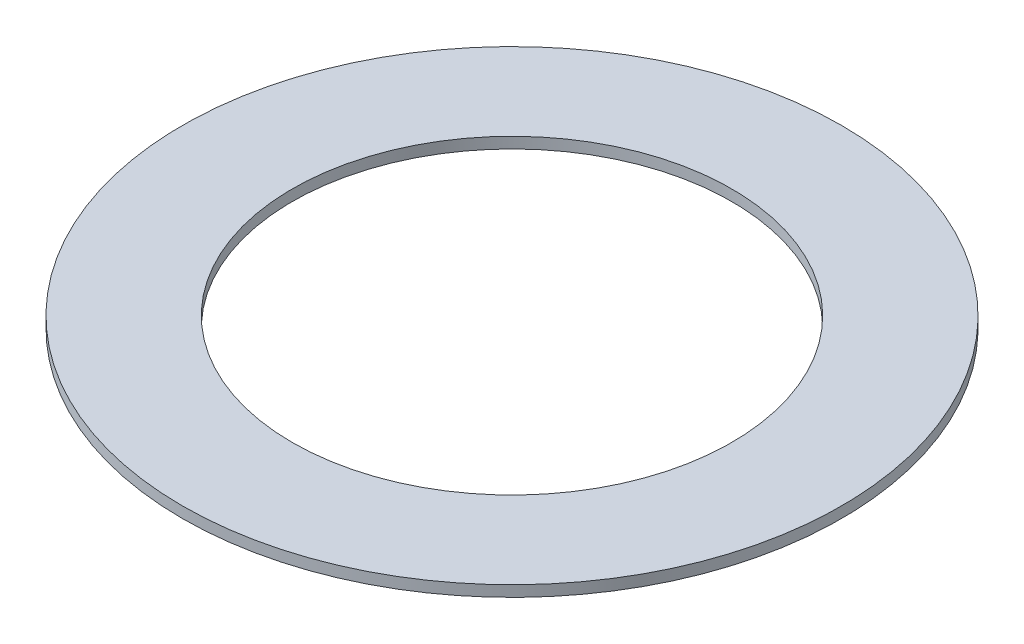
ISO-10303-21;
HEADER;
FILE_DESCRIPTION(('STEP AP214'),'2;1');
FILE_NAME('part.step','',(''),(''),'','','');
FILE_SCHEMA(('AUTOMOTIVE_DESIGN { 1 0 10303 214 1 1 1 1 }'));
ENDSEC;
DATA;
#1=APPLICATION_CONTEXT('core data for automotive mechanical design processes');
#2=APPLICATION_PROTOCOL_DEFINITION('international standard','automotive_design',2000,#1);
#3=PRODUCT_CONTEXT('',#1,'mechanical');
#4=PRODUCT('Part','Part','',(#3));
#5=PRODUCT_RELATED_PRODUCT_CATEGORY('part','',(#4));
#6=PRODUCT_DEFINITION_FORMATION('','',#4);
#7=PRODUCT_DEFINITION_CONTEXT('part definition',#1,'design');
#8=PRODUCT_DEFINITION('design','',#6,#7);
#9=PRODUCT_DEFINITION_SHAPE('','',#8);
#10=(LENGTH_UNIT() NAMED_UNIT(*) SI_UNIT(.MILLI.,.METRE.));
#11=(NAMED_UNIT(*) PLANE_ANGLE_UNIT() SI_UNIT($,.RADIAN.));
#12=(NAMED_UNIT(*) SI_UNIT($,.STERADIAN.) SOLID_ANGLE_UNIT());
#13=UNCERTAINTY_MEASURE_WITH_UNIT(LENGTH_MEASURE(1.E-05),#10,'distance_accuracy_value','');
#14=(GEOMETRIC_REPRESENTATION_CONTEXT(3) GLOBAL_UNCERTAINTY_ASSIGNED_CONTEXT((#13)) GLOBAL_UNIT_ASSIGNED_CONTEXT((#10,
#11,#12)) REPRESENTATION_CONTEXT('',''));
#15=CARTESIAN_POINT('',(0.,0.,0.));
#16=DIRECTION('',(0.,0.,1.));
#17=DIRECTION('',(1.,0.,0.));
#18=AXIS2_PLACEMENT_3D('',#15,#16,#17);
#19=CARTESIAN_POINT('',(0.,1.,0.));
#20=DIRECTION('',(0.,1.,0.));
#21=DIRECTION('',(0.,0.,1.));
#22=AXIS2_PLACEMENT_3D('',#19,#20,#21);
#23=PLANE('',#22);
#24=CARTESIAN_POINT('',(0.,1.,0.));
#25=DIRECTION('',(0.,1.,0.));
#26=DIRECTION('',(0.,0.,1.));
#27=AXIS2_PLACEMENT_3D('',#24,#25,#26);
#28=CIRCLE('',#27,30.);
#29=CARTESIAN_POINT('',(0.,1.,30.));
#30=VERTEX_POINT('',#29);
#31=EDGE_CURVE('E10',#30,#30,#28,.T.);
#32=ORIENTED_EDGE('',*,*,#31,.T.);
#33=EDGE_LOOP('',(#32));
#34=FACE_BOUND('',#33,.T.);
#35=CARTESIAN_POINT('',(0.,1.,0.));
#36=DIRECTION('',(0.,1.,0.));
#37=DIRECTION('',(0.,0.,1.));
#38=AXIS2_PLACEMENT_3D('',#35,#36,#37);
#39=CIRCLE('',#38,20.);
#40=CARTESIAN_POINT('',(0.,1.,20.));
#41=VERTEX_POINT('',#40);
#42=EDGE_CURVE('E42',#41,#41,#39,.T.);
#43=ORIENTED_EDGE('',*,*,#42,.F.);
#44=EDGE_LOOP('',(#43));
#45=FACE_BOUND('',#44,.T.);
#46=ADVANCED_FACE('F31',(#34,#45),#23,.T.);
#47=CARTESIAN_POINT('',(0.,0.,0.));
#48=DIRECTION('',(0.,1.,0.));
#49=DIRECTION('',(0.,0.,1.));
#50=AXIS2_PLACEMENT_3D('',#47,#48,#49);
#51=PLANE('',#50);
#52=CARTESIAN_POINT('',(0.,0.,0.));
#53=DIRECTION('',(0.,1.,0.));
#54=DIRECTION('',(0.,0.,1.));
#55=AXIS2_PLACEMENT_3D('',#52,#53,#54);
#56=CIRCLE('',#55,30.);
#57=CARTESIAN_POINT('',(0.,0.,30.));
#58=VERTEX_POINT('',#57);
#59=EDGE_CURVE('E35',#58,#58,#56,.T.);
#60=ORIENTED_EDGE('',*,*,#59,.F.);
#61=EDGE_LOOP('',(#60));
#62=FACE_BOUND('',#61,.T.);
#63=CARTESIAN_POINT('',(0.,0.,0.));
#64=DIRECTION('',(0.,1.,0.));
#65=DIRECTION('',(0.,0.,1.));
#66=AXIS2_PLACEMENT_3D('',#63,#64,#65);
#67=CIRCLE('',#66,20.);
#68=CARTESIAN_POINT('',(0.,0.,20.));
#69=VERTEX_POINT('',#68);
#70=EDGE_CURVE('E44',#69,#69,#67,.T.);
#71=ORIENTED_EDGE('',*,*,#70,.T.);
#72=EDGE_LOOP('',(#71));
#73=FACE_BOUND('',#72,.T.);
#74=ADVANCED_FACE('F54',(#62,#73),#51,.F.);
#75=CARTESIAN_POINT('',(0.,1.,0.));
#76=DIRECTION('',(0.,-1.,0.));
#77=DIRECTION('',(0.,0.,-1.));
#78=AXIS2_PLACEMENT_3D('',#75,#76,#77);
#79=CYLINDRICAL_SURFACE('',#78,30.);
#80=ORIENTED_EDGE('',*,*,#31,.F.);
#81=EDGE_LOOP('',(#80));
#82=FACE_BOUND('',#81,.T.);
#83=ORIENTED_EDGE('',*,*,#59,.T.);
#84=EDGE_LOOP('',(#83));
#85=FACE_BOUND('',#84,.T.);
#86=ADVANCED_FACE('F33',(#82,#85),#79,.T.);
#87=CARTESIAN_POINT('',(0.,1.,0.));
#88=DIRECTION('',(0.,-1.,0.));
#89=DIRECTION('',(0.,0.,-1.));
#90=AXIS2_PLACEMENT_3D('',#87,#88,#89);
#91=CYLINDRICAL_SURFACE('',#90,20.);
#92=ORIENTED_EDGE('',*,*,#42,.T.);
#93=EDGE_LOOP('',(#92));
#94=FACE_BOUND('',#93,.T.);
#95=ORIENTED_EDGE('',*,*,#70,.F.);
#96=EDGE_LOOP('',(#95));
#97=FACE_BOUND('',#96,.T.);
#98=ADVANCED_FACE('F50',(#94,#97),#91,.F.);
#99=CLOSED_SHELL('',(#46,#74,#86,#98));
#100=MANIFOLD_SOLID_BREP('B2',#99);
#101=ADVANCED_BREP_SHAPE_REPRESENTATION('',(#18,#100),#14);
#102=SHAPE_DEFINITION_REPRESENTATION(#9,#101);
ENDSEC;
END-ISO-10303-21;
